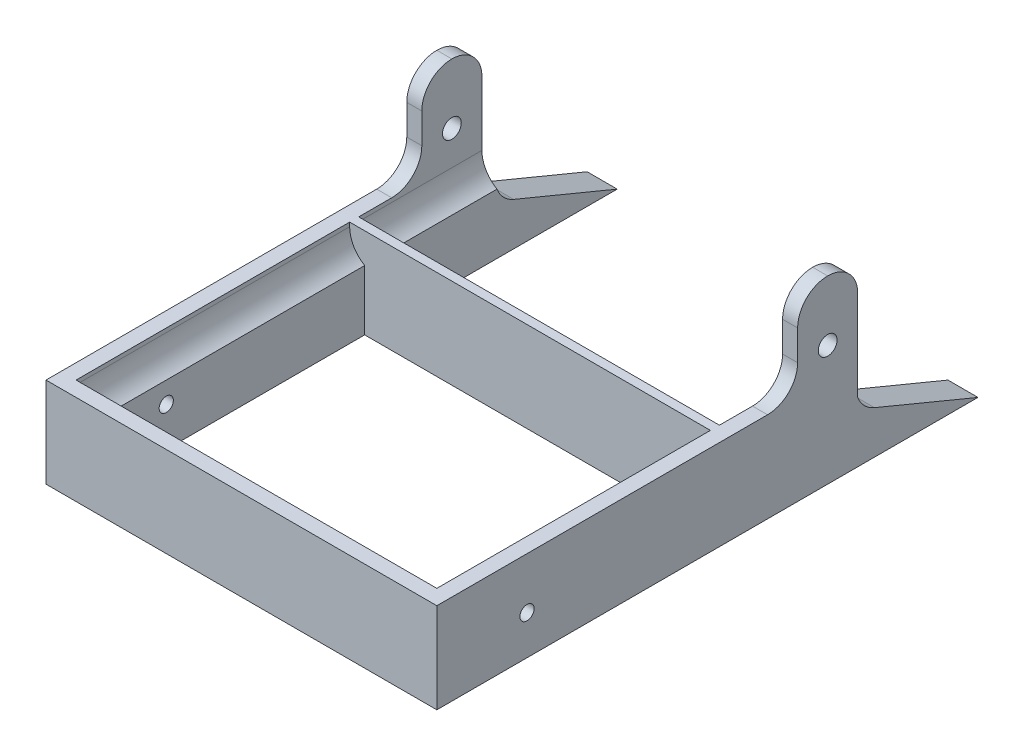
ISO-10303-21;
HEADER;
FILE_DESCRIPTION(('STEP AP214'),'2;1');
FILE_NAME('part.step','',(''),(''),'','','');
FILE_SCHEMA(('AUTOMOTIVE_DESIGN { 1 0 10303 214 1 1 1 1 }'));
ENDSEC;
DATA;
#1=APPLICATION_CONTEXT('core data for automotive mechanical design processes');
#2=APPLICATION_PROTOCOL_DEFINITION('international standard','automotive_design',2000,#1);
#3=PRODUCT_CONTEXT('',#1,'mechanical');
#4=PRODUCT('Part','Part','',(#3));
#5=PRODUCT_RELATED_PRODUCT_CATEGORY('part','',(#4));
#6=PRODUCT_DEFINITION_FORMATION('','',#4);
#7=PRODUCT_DEFINITION_CONTEXT('part definition',#1,'design');
#8=PRODUCT_DEFINITION('design','',#6,#7);
#9=PRODUCT_DEFINITION_SHAPE('','',#8);
#10=(LENGTH_UNIT() NAMED_UNIT(*) SI_UNIT(.MILLI.,.METRE.));
#11=(NAMED_UNIT(*) PLANE_ANGLE_UNIT() SI_UNIT($,.RADIAN.));
#12=(NAMED_UNIT(*) SI_UNIT($,.STERADIAN.) SOLID_ANGLE_UNIT());
#13=UNCERTAINTY_MEASURE_WITH_UNIT(LENGTH_MEASURE(1.E-05),#10,'distance_accuracy_value','');
#14=(GEOMETRIC_REPRESENTATION_CONTEXT(3) GLOBAL_UNCERTAINTY_ASSIGNED_CONTEXT((#13)) GLOBAL_UNIT_ASSIGNED_CONTEXT((#10,
#11,#12)) REPRESENTATION_CONTEXT('',''));
#15=CARTESIAN_POINT('',(0.,0.,0.));
#16=DIRECTION('',(0.,0.,1.));
#17=DIRECTION('',(1.,0.,0.));
#18=AXIS2_PLACEMENT_3D('',#15,#16,#17);
#19=CARTESIAN_POINT('',(0.,0.,0.));
#20=DIRECTION('',(1.,0.,0.));
#21=DIRECTION('',(0.,0.,1.));
#22=AXIS2_PLACEMENT_3D('',#19,#20,#21);
#23=PLANE('',#22);
#24=DIRECTION('',(0.,-1.,0.));
#25=VECTOR('',#24,1.);
#26=CARTESIAN_POINT('',(0.,0.,171.45));
#27=LINE('',#26,#25);
#28=CARTESIAN_POINT('',(0.,19.05,171.45));
#29=VERTEX_POINT('',#28);
#30=CARTESIAN_POINT('',(0.,-6.35,171.45));
#31=VERTEX_POINT('',#30);
#32=EDGE_CURVE('E375',#29,#31,#27,.T.);
#33=ORIENTED_EDGE('',*,*,#32,.T.);
#34=DIRECTION('',(0.,0.,-1.));
#35=VECTOR('',#34,1.);
#36=CARTESIAN_POINT('',(0.,-6.34999999999999,-50.8));
#37=LINE('',#36,#35);
#38=CARTESIAN_POINT('',(0.,-6.35000000000001,55.88));
#39=VERTEX_POINT('',#38);
#40=EDGE_CURVE('E445',#31,#39,#37,.T.);
#41=ORIENTED_EDGE('',*,*,#40,.T.);
#42=DIRECTION('',(0.,1.,0.));
#43=VECTOR('',#42,1.);
#44=CARTESIAN_POINT('',(0.,0.,55.88));
#45=LINE('',#44,#43);
#46=CARTESIAN_POINT('',(0.,19.05,55.88));
#47=VERTEX_POINT('',#46);
#48=EDGE_CURVE('E391',#39,#47,#45,.T.);
#49=ORIENTED_EDGE('',*,*,#48,.T.);
#50=DIRECTION('',(0.,0.,1.));
#51=VECTOR('',#50,1.);
#52=CARTESIAN_POINT('',(0.,19.05,25.4));
#53=LINE('',#52,#51);
#54=EDGE_CURVE('E451',#47,#29,#53,.T.);
#55=ORIENTED_EDGE('',*,*,#54,.T.);
#56=EDGE_LOOP('',(#33,#41,#49,#55));
#57=FACE_BOUND('',#56,.T.);
#58=CARTESIAN_POINT('',(0.,10.16,139.7));
#59=DIRECTION('',(-1.,0.,0.));
#60=DIRECTION('',(0.,0.,1.));
#61=AXIS2_PLACEMENT_3D('',#58,#59,#60);
#62=CIRCLE('',#61,2.99999999999999);
#63=CARTESIAN_POINT('',(0.,10.16,142.7));
#64=VERTEX_POINT('',#63);
#65=EDGE_CURVE('E394',#64,#64,#62,.T.);
#66=ORIENTED_EDGE('',*,*,#65,.T.);
#67=EDGE_LOOP('',(#66));
#68=FACE_BOUND('',#67,.T.);
#69=ADVANCED_FACE('F43',(#57,#68),#23,.T.);
#70=CARTESIAN_POINT('',(-6.35,23.513519620022,-11.8897852210071));
#71=DIRECTION('',(-1.,0.,0.));
#72=DIRECTION('',(0.,0.,-1.));
#73=AXIS2_PLACEMENT_3D('',#70,#71,#72);
#74=PLANE('',#73);
#75=DIRECTION('',(0.,0.,-1.));
#76=VECTOR('',#75,1.);
#77=CARTESIAN_POINT('',(-6.35,30.0485226280624,-11.8897852210071));
#78=LINE('',#77,#76);
#79=CARTESIAN_POINT('',(-6.35,30.0485226280624,55.88));
#80=VERTEX_POINT('',#79);
#81=CARTESIAN_POINT('',(-6.35,30.0485226280624,171.45));
#82=VERTEX_POINT('',#81);
#83=EDGE_CURVE('E462',#80,#82,#78,.F.);
#84=ORIENTED_EDGE('',*,*,#83,.F.);
#85=DIRECTION('',(0.,1.,0.));
#86=VECTOR('',#85,1.);
#87=CARTESIAN_POINT('',(-6.35,31.75,55.88));
#88=LINE('',#87,#86);
#89=CARTESIAN_POINT('',(-6.35,31.75,55.8800000000001));
#90=VERTEX_POINT('',#89);
#91=EDGE_CURVE('E383',#80,#90,#88,.T.);
#92=ORIENTED_EDGE('',*,*,#91,.T.);
#93=DIRECTION('',(0.,0.,-1.));
#94=VECTOR('',#93,1.);
#95=CARTESIAN_POINT('',(-6.35,31.75,177.8));
#96=LINE('',#95,#94);
#97=CARTESIAN_POINT('',(-6.35,31.75,171.45));
#98=VERTEX_POINT('',#97);
#99=EDGE_CURVE('E408',#98,#90,#96,.T.);
#100=ORIENTED_EDGE('',*,*,#99,.F.);
#101=DIRECTION('',(0.,-1.,0.));
#102=VECTOR('',#101,1.);
#103=CARTESIAN_POINT('',(-6.35,31.75,171.45));
#104=LINE('',#103,#102);
#105=EDGE_CURVE('E255',#98,#82,#104,.T.);
#106=ORIENTED_EDGE('',*,*,#105,.T.);
#107=EDGE_LOOP('',(#84,#92,#100,#106));
#108=FACE_BOUND('',#107,.T.);
#109=ADVANCED_FACE('F576',(#108),#74,.F.);
#110=CARTESIAN_POINT('',(6.35,30.0485226280624,25.4));
#111=DIRECTION('',(0.,0.,-1.));
#112=DIRECTION('',(1.,0.,0.));
#113=AXIS2_PLACEMENT_3D('',#110,#111,#112);
#114=CYLINDRICAL_SURFACE('',#113,12.7);
#115=ORIENTED_EDGE('',*,*,#54,.F.);
#116=CARTESIAN_POINT('',(6.35,30.0485226280624,55.88));
#117=DIRECTION('',(0.,0.,-1.));
#118=DIRECTION('',(0.,-1.,0.));
#119=AXIS2_PLACEMENT_3D('',#116,#117,#118);
#120=CIRCLE('',#119,12.7);
#121=EDGE_CURVE('E12',#80,#47,#120,.F.);
#122=ORIENTED_EDGE('',*,*,#121,.F.);
#123=ORIENTED_EDGE('',*,*,#83,.T.);
#124=CARTESIAN_POINT('',(6.35,30.0485226280624,171.45));
#125=DIRECTION('',(0.,0.,1.));
#126=DIRECTION('',(1.,0.,0.));
#127=AXIS2_PLACEMENT_3D('',#124,#125,#126);
#128=CIRCLE('',#127,12.7);
#129=EDGE_CURVE('E260',#29,#82,#128,.F.);
#130=ORIENTED_EDGE('',*,*,#129,.F.);
#131=EDGE_LOOP('',(#115,#122,#123,#130));
#132=FACE_BOUND('',#131,.T.);
#133=ADVANCED_FACE('F583',(#132),#114,.F.);
#134=CARTESIAN_POINT('',(-6.35,-6.35,25.4));
#135=DIRECTION('',(0.,0.,-1.));
#136=DIRECTION('',(0.,1.,0.));
#137=AXIS2_PLACEMENT_3D('',#134,#135,#136);
#138=PLANE('',#137);
#139=DIRECTION('',(0.,-1.,0.));
#140=VECTOR('',#139,1.);
#141=CARTESIAN_POINT('',(-6.35,-6.35,25.4));
#142=LINE('',#141,#140);
#143=CARTESIAN_POINT('',(-6.35,57.15,25.4));
#144=VERTEX_POINT('',#143);
#145=CARTESIAN_POINT('',(-6.35,44.45,25.4));
#146=VERTEX_POINT('',#145);
#147=EDGE_CURVE('E420',#144,#146,#142,.T.);
#148=ORIENTED_EDGE('',*,*,#147,.F.);
#149=DIRECTION('',(1.,0.,0.));
#150=VECTOR('',#149,1.);
#151=CARTESIAN_POINT('',(-6.35,57.15,25.4));
#152=LINE('',#151,#150);
#153=CARTESIAN_POINT('',(-12.7,57.15,25.4));
#154=VERTEX_POINT('',#153);
#155=EDGE_CURVE('E482',#154,#144,#152,.T.);
#156=ORIENTED_EDGE('',*,*,#155,.F.);
#157=DIRECTION('',(0.,-1.,0.));
#158=VECTOR('',#157,1.);
#159=CARTESIAN_POINT('',(-12.7,-6.35,25.4));
#160=LINE('',#159,#158);
#161=CARTESIAN_POINT('',(-12.7,44.45,25.4));
#162=VERTEX_POINT('',#161);
#163=EDGE_CURVE('E421',#154,#162,#160,.T.);
#164=ORIENTED_EDGE('',*,*,#163,.T.);
#165=DIRECTION('',(1.,0.,0.));
#166=VECTOR('',#165,1.);
#167=CARTESIAN_POINT('',(-12.7,44.45,25.4));
#168=LINE('',#167,#166);
#169=EDGE_CURVE('E488',#146,#162,#168,.F.);
#170=ORIENTED_EDGE('',*,*,#169,.F.);
#171=EDGE_LOOP('',(#148,#156,#164,#170));
#172=FACE_BOUND('',#171,.T.);
#173=ADVANCED_FACE('F524',(#172),#138,.F.);
#174=CARTESIAN_POINT('',(-6.35,-6.34999999999999,-50.8));
#175=DIRECTION('',(0.,1.,0.));
#176=DIRECTION('',(0.,0.,1.));
#177=AXIS2_PLACEMENT_3D('',#174,#175,#176);
#178=PLANE('',#177);
#179=DIRECTION('',(-1.,0.,0.));
#180=VECTOR('',#179,1.);
#181=CARTESIAN_POINT('',(0.,-6.35,177.8));
#182=LINE('',#181,#180);
#183=CARTESIAN_POINT('',(152.4,-6.35,177.8));
#184=VERTEX_POINT('',#183);
#185=CARTESIAN_POINT('',(-12.7,-6.35,177.8));
#186=VERTEX_POINT('',#185);
#187=EDGE_CURVE('E405',#184,#186,#182,.T.);
#188=ORIENTED_EDGE('',*,*,#187,.T.);
#189=DIRECTION('',(0.,0.,-1.));
#190=VECTOR('',#189,1.);
#191=CARTESIAN_POINT('',(-12.7,-6.35,25.4));
#192=LINE('',#191,#190);
#193=CARTESIAN_POINT('',(-12.7,-6.34999999999999,-50.8));
#194=VERTEX_POINT('',#193);
#195=EDGE_CURVE('E424',#186,#194,#192,.T.);
#196=ORIENTED_EDGE('',*,*,#195,.T.);
#197=DIRECTION('',(1.,0.,0.));
#198=VECTOR('',#197,1.);
#199=CARTESIAN_POINT('',(-6.35,-6.34999999999999,-50.8));
#200=LINE('',#199,#198);
#201=CARTESIAN_POINT('',(0.,-6.34999999999999,-50.8));
#202=VERTEX_POINT('',#201);
#203=EDGE_CURVE('E454',#194,#202,#200,.T.);
#204=ORIENTED_EDGE('',*,*,#203,.T.);
#205=CARTESIAN_POINT('',(0.,-6.35000000000001,52.07));
#206=VERTEX_POINT('',#205);
#207=EDGE_CURVE('E444',#206,#202,#37,.T.);
#208=ORIENTED_EDGE('',*,*,#207,.F.);
#209=DIRECTION('',(1.,0.,0.));
#210=VECTOR('',#209,1.);
#211=CARTESIAN_POINT('',(-44.9755420673937,-6.35,52.07));
#212=LINE('',#211,#210);
#213=CARTESIAN_POINT('',(139.7,-6.35000000000001,52.07));
#214=VERTEX_POINT('',#213);
#215=EDGE_CURVE('E381',#206,#214,#212,.T.);
#216=ORIENTED_EDGE('',*,*,#215,.T.);
#217=DIRECTION('',(0.,0.,-1.));
#218=VECTOR('',#217,1.);
#219=CARTESIAN_POINT('',(139.7,-6.34999999999999,-50.8));
#220=LINE('',#219,#218);
#221=CARTESIAN_POINT('',(139.7,-6.34999999999999,-50.8));
#222=VERTEX_POINT('',#221);
#223=EDGE_CURVE('E316',#214,#222,#220,.T.);
#224=ORIENTED_EDGE('',*,*,#223,.T.);
#225=DIRECTION('',(-1.,0.,0.));
#226=VECTOR('',#225,1.);
#227=CARTESIAN_POINT('',(146.05,-6.34999999999999,-50.8));
#228=LINE('',#227,#226);
#229=CARTESIAN_POINT('',(152.4,-6.34999999999999,-50.8));
#230=VERTEX_POINT('',#229);
#231=EDGE_CURVE('E325',#230,#222,#228,.T.);
#232=ORIENTED_EDGE('',*,*,#231,.F.);
#233=DIRECTION('',(0.,0.,-1.));
#234=VECTOR('',#233,1.);
#235=CARTESIAN_POINT('',(152.4,-6.35,25.4));
#236=LINE('',#235,#234);
#237=EDGE_CURVE('E296',#184,#230,#236,.T.);
#238=ORIENTED_EDGE('',*,*,#237,.F.);
#239=EDGE_LOOP('',(#188,#196,#204,#208,#216,#224,#232,#238));
#240=FACE_BOUND('',#239,.T.);
#241=ORIENTED_EDGE('',*,*,#40,.F.);
#242=DIRECTION('',(1.,0.,0.));
#243=VECTOR('',#242,1.);
#244=CARTESIAN_POINT('',(-44.9755420673937,-6.35,171.45));
#245=LINE('',#244,#243);
#246=CARTESIAN_POINT('',(139.7,-6.35,171.45));
#247=VERTEX_POINT('',#246);
#248=EDGE_CURVE('E371',#31,#247,#245,.T.);
#249=ORIENTED_EDGE('',*,*,#248,.T.);
#250=CARTESIAN_POINT('',(139.7,-6.35000000000001,55.88));
#251=VERTEX_POINT('',#250);
#252=EDGE_CURVE('E317',#247,#251,#220,.T.);
#253=ORIENTED_EDGE('',*,*,#252,.T.);
#254=DIRECTION('',(1.,0.,0.));
#255=VECTOR('',#254,1.);
#256=CARTESIAN_POINT('',(-44.9755420673937,-6.35,55.88));
#257=LINE('',#256,#255);
#258=EDGE_CURVE('E66',#39,#251,#257,.T.);
#259=ORIENTED_EDGE('',*,*,#258,.F.);
#260=EDGE_LOOP('',(#241,#249,#253,#259));
#261=FACE_BOUND('',#260,.T.);
#262=ADVANCED_FACE('F598',(#240,#261),#178,.F.);
#263=CARTESIAN_POINT('',(-6.35,14.6920489685529,0.));
#264=DIRECTION('',(0.,-0.923879532511289,0.382683432365084));
#265=DIRECTION('',(0.,-0.382683432365084,-0.923879532511289));
#266=AXIS2_PLACEMENT_3D('',#263,#264,#265);
#267=PLANE('',#266);
#268=DIRECTION('',(0.,0.382683432365084,0.923879532511289));
#269=VECTOR('',#268,1.);
#270=CARTESIAN_POINT('',(0.,14.6920489685529,0.));
#271=LINE('',#270,#269);
#272=CARTESIAN_POINT('',(0.,11.7802495571286,-7.02970562997053));
#273=VERTEX_POINT('',#272);
#274=EDGE_CURVE('E448',#202,#273,#271,.T.);
#275=ORIENTED_EDGE('',*,*,#274,.F.);
#276=ORIENTED_EDGE('',*,*,#203,.F.);
#277=DIRECTION('',(0.,0.382683432365084,0.923879532511289));
#278=VECTOR('',#277,1.);
#279=CARTESIAN_POINT('',(-12.7,-6.34999999999999,-50.8));
#280=LINE('',#279,#278);
#281=CARTESIAN_POINT('',(-12.7,11.7802495571286,-7.02970562997053));
#282=VERTEX_POINT('',#281);
#283=EDGE_CURVE('E428',#194,#282,#280,.T.);
#284=ORIENTED_EDGE('',*,*,#283,.T.);
#285=DIRECTION('',(-1.,0.,0.));
#286=VECTOR('',#285,1.);
#287=CARTESIAN_POINT('',(-6.35,11.7802495571286,-7.02970562997053));
#288=LINE('',#287,#286);
#289=EDGE_CURVE('E457',#273,#282,#288,.T.);
#290=ORIENTED_EDGE('',*,*,#289,.F.);
#291=EDGE_LOOP('',(#275,#276,#284,#290));
#292=FACE_BOUND('',#291,.T.);
#293=ADVANCED_FACE('F591',(#292),#267,.F.);
#294=DIRECTION('',(0.,-1.,0.));
#295=VECTOR('',#294,1.);
#296=CARTESIAN_POINT('',(0.,0.,52.07));
#297=LINE('',#296,#295);
#298=CARTESIAN_POINT('',(0.,19.05,52.07));
#299=VERTEX_POINT('',#298);
#300=EDGE_CURVE('E58',#299,#206,#297,.T.);
#301=ORIENTED_EDGE('',*,*,#300,.T.);
#302=ORIENTED_EDGE('',*,*,#207,.T.);
#303=ORIENTED_EDGE('',*,*,#274,.T.);
#304=CARTESIAN_POINT('',(0.,23.513519620022,-11.8897852210071));
#305=DIRECTION('',(-1.,0.,0.));
#306=DIRECTION('',(0.,0.,1.));
#307=AXIS2_PLACEMENT_3D('',#304,#305,#306);
#308=CIRCLE('',#307,12.7);
#309=CARTESIAN_POINT('',(0.,19.05,0.));
#310=VERTEX_POINT('',#309);
#311=EDGE_CURVE('E460',#310,#273,#308,.F.);
#312=ORIENTED_EDGE('',*,*,#311,.F.);
#313=EDGE_CURVE('E452',#310,#299,#53,.T.);
#314=ORIENTED_EDGE('',*,*,#313,.T.);
#315=EDGE_LOOP('',(#301,#302,#303,#312,#314));
#316=FACE_BOUND('',#315,.T.);
#317=ADVANCED_FACE('F579',(#316),#23,.T.);
#318=CARTESIAN_POINT('',(-6.35,23.513519620022,-11.8897852210071));
#319=DIRECTION('',(-1.,0.,0.));
#320=DIRECTION('',(0.,0.,-1.));
#321=AXIS2_PLACEMENT_3D('',#318,#319,#320);
#322=CYLINDRICAL_SURFACE('',#321,12.7);
#323=ORIENTED_EDGE('',*,*,#311,.T.);
#324=ORIENTED_EDGE('',*,*,#289,.T.);
#325=CARTESIAN_POINT('',(-12.7,23.513519620022,-11.8897852210071));
#326=DIRECTION('',(-1.,0.,0.));
#327=DIRECTION('',(0.,0.,-1.));
#328=AXIS2_PLACEMENT_3D('',#325,#326,#327);
#329=CIRCLE('',#328,12.7);
#330=CARTESIAN_POINT('',(-12.7,19.05,0.));
#331=VERTEX_POINT('',#330);
#332=EDGE_CURVE('E431',#282,#331,#329,.T.);
#333=ORIENTED_EDGE('',*,*,#332,.T.);
#334=DIRECTION('',(1.,0.,0.));
#335=VECTOR('',#334,1.);
#336=CARTESIAN_POINT('',(-12.7,19.05,0.));
#337=LINE('',#336,#335);
#338=EDGE_CURVE('E437',#331,#310,#337,.T.);
#339=ORIENTED_EDGE('',*,*,#338,.T.);
#340=EDGE_LOOP('',(#323,#324,#333,#339));
#341=FACE_BOUND('',#340,.T.);
#342=ADVANCED_FACE('F590',(#341),#322,.F.);
#343=CARTESIAN_POINT('',(-6.35,44.45,12.7));
#344=DIRECTION('',(1.,0.,0.));
#345=DIRECTION('',(0.,0.,-1.));
#346=AXIS2_PLACEMENT_3D('',#343,#344,#345);
#347=CIRCLE('',#346,3.96875);
#348=CARTESIAN_POINT('',(-6.35,44.45,8.73124999999999));
#349=VERTEX_POINT('',#348);
#350=EDGE_CURVE('E417',#349,#349,#347,.T.);
#351=ORIENTED_EDGE('',*,*,#350,.F.);
#352=EDGE_LOOP('',(#351));
#353=FACE_BOUND('',#352,.T.);
#354=CARTESIAN_POINT('',(-6.35,30.0485226280624,0.));
#355=VERTEX_POINT('',#354);
#356=CARTESIAN_POINT('',(-6.35,30.0485226280624,52.07));
#357=VERTEX_POINT('',#356);
#358=EDGE_CURVE('E463',#355,#357,#78,.F.);
#359=ORIENTED_EDGE('',*,*,#358,.F.);
#360=DIRECTION('',(0.,1.,0.));
#361=VECTOR('',#360,1.);
#362=CARTESIAN_POINT('',(-6.35,19.05,0.));
#363=LINE('',#362,#361);
#364=CARTESIAN_POINT('',(-6.35,57.15,0.));
#365=VERTEX_POINT('',#364);
#366=EDGE_CURVE('E425',#355,#365,#363,.T.);
#367=ORIENTED_EDGE('',*,*,#366,.T.);
#368=CARTESIAN_POINT('',(-6.35,57.15,12.7));
#369=DIRECTION('',(1.,0.,0.));
#370=DIRECTION('',(0.,0.,-1.));
#371=AXIS2_PLACEMENT_3D('',#368,#369,#370);
#372=CIRCLE('',#371,12.7);
#373=CARTESIAN_POINT('',(-6.35,69.85,12.7));
#374=VERTEX_POINT('',#373);
#375=EDGE_CURVE('E471',#374,#365,#372,.F.);
#376=ORIENTED_EDGE('',*,*,#375,.F.);
#377=CARTESIAN_POINT('',(-6.35,57.15,12.7));
#378=DIRECTION('',(1.,0.,0.));
#379=DIRECTION('',(0.,0.,-1.));
#380=AXIS2_PLACEMENT_3D('',#377,#378,#379);
#381=CIRCLE('',#380,12.7);
#382=EDGE_CURVE('E468',#144,#374,#381,.F.);
#383=ORIENTED_EDGE('',*,*,#382,.F.);
#384=ORIENTED_EDGE('',*,*,#147,.T.);
#385=CARTESIAN_POINT('',(-6.35,44.45,38.1));
#386=DIRECTION('',(1.,0.,0.));
#387=DIRECTION('',(0.,0.,-1.));
#388=AXIS2_PLACEMENT_3D('',#385,#386,#387);
#389=CIRCLE('',#388,12.7);
#390=CARTESIAN_POINT('',(-6.35,31.75,38.1000000000001));
#391=VERTEX_POINT('',#390);
#392=EDGE_CURVE('E491',#391,#146,#389,.T.);
#393=ORIENTED_EDGE('',*,*,#392,.F.);
#394=CARTESIAN_POINT('',(-6.35,31.75,52.07));
#395=VERTEX_POINT('',#394);
#396=EDGE_CURVE('E407',#395,#391,#96,.T.);
#397=ORIENTED_EDGE('',*,*,#396,.F.);
#398=DIRECTION('',(0.,-1.,0.));
#399=VECTOR('',#398,1.);
#400=CARTESIAN_POINT('',(-6.35,31.75,52.07));
#401=LINE('',#400,#399);
#402=EDGE_CURVE('E378',#395,#357,#401,.T.);
#403=ORIENTED_EDGE('',*,*,#402,.T.);
#404=EDGE_LOOP('',(#359,#367,#376,#383,#384,#393,#397,#403));
#405=FACE_BOUND('',#404,.T.);
#406=ADVANCED_FACE('F504',(#353,#405),#74,.F.);
#407=CARTESIAN_POINT('',(-12.7,19.05,0.));
#408=DIRECTION('',(0.,0.,1.));
#409=DIRECTION('',(0.,-1.,0.));
#410=AXIS2_PLACEMENT_3D('',#407,#408,#409);
#411=PLANE('',#410);
#412=ORIENTED_EDGE('',*,*,#366,.F.);
#413=CARTESIAN_POINT('',(6.35,30.0485226280624,0.));
#414=DIRECTION('',(0.,0.,-1.));
#415=DIRECTION('',(0.,-1.,0.));
#416=AXIS2_PLACEMENT_3D('',#413,#414,#415);
#417=CIRCLE('',#416,12.7);
#418=EDGE_CURVE('E466',#310,#355,#417,.T.);
#419=ORIENTED_EDGE('',*,*,#418,.F.);
#420=ORIENTED_EDGE('',*,*,#338,.F.);
#421=DIRECTION('',(0.,1.,0.));
#422=VECTOR('',#421,1.);
#423=CARTESIAN_POINT('',(-12.7,19.05,0.));
#424=LINE('',#423,#422);
#425=CARTESIAN_POINT('',(-12.7,57.15,0.));
#426=VERTEX_POINT('',#425);
#427=EDGE_CURVE('E434',#331,#426,#424,.T.);
#428=ORIENTED_EDGE('',*,*,#427,.T.);
#429=DIRECTION('',(1.,0.,0.));
#430=VECTOR('',#429,1.);
#431=CARTESIAN_POINT('',(-12.7,57.15,0.));
#432=LINE('',#431,#430);
#433=EDGE_CURVE('E474',#365,#426,#432,.F.);
#434=ORIENTED_EDGE('',*,*,#433,.F.);
#435=EDGE_LOOP('',(#412,#419,#420,#428,#434));
#436=FACE_BOUND('',#435,.T.);
#437=ADVANCED_FACE('F512',(#436),#411,.F.);
#438=CARTESIAN_POINT('',(-12.7,23.513519620022,-11.8897852210071));
#439=DIRECTION('',(-1.,0.,0.));
#440=DIRECTION('',(0.,0.,-1.));
#441=AXIS2_PLACEMENT_3D('',#438,#439,#440);
#442=PLANE('',#441);
#443=CARTESIAN_POINT('',(-12.7,10.16,139.7));
#444=DIRECTION('',(-1.,0.,0.));
#445=DIRECTION('',(0.,0.,1.));
#446=AXIS2_PLACEMENT_3D('',#443,#444,#445);
#447=CIRCLE('',#446,2.99999999999999);
#448=CARTESIAN_POINT('',(-12.7,10.16,142.7));
#449=VERTEX_POINT('',#448);
#450=EDGE_CURVE('E395',#449,#449,#447,.T.);
#451=ORIENTED_EDGE('',*,*,#450,.F.);
#452=EDGE_LOOP('',(#451));
#453=FACE_BOUND('',#452,.T.);
#454=CARTESIAN_POINT('',(-12.7,44.45,12.7));
#455=DIRECTION('',(1.,0.,0.));
#456=DIRECTION('',(0.,0.,-1.));
#457=AXIS2_PLACEMENT_3D('',#454,#455,#456);
#458=CIRCLE('',#457,3.96875);
#459=CARTESIAN_POINT('',(-12.7,44.45,8.73124999999999));
#460=VERTEX_POINT('',#459);
#461=EDGE_CURVE('E414',#460,#460,#458,.T.);
#462=ORIENTED_EDGE('',*,*,#461,.T.);
#463=EDGE_LOOP('',(#462));
#464=FACE_BOUND('',#463,.T.);
#465=ORIENTED_EDGE('',*,*,#427,.F.);
#466=ORIENTED_EDGE('',*,*,#332,.F.);
#467=ORIENTED_EDGE('',*,*,#283,.F.);
#468=ORIENTED_EDGE('',*,*,#195,.F.);
#469=DIRECTION('',(0.,1.,0.));
#470=VECTOR('',#469,1.);
#471=CARTESIAN_POINT('',(-12.7,31.75,177.8));
#472=LINE('',#471,#470);
#473=CARTESIAN_POINT('',(-12.7,31.75,177.8));
#474=VERTEX_POINT('',#473);
#475=EDGE_CURVE('E398',#186,#474,#472,.T.);
#476=ORIENTED_EDGE('',*,*,#475,.T.);
#477=DIRECTION('',(0.,0.,-1.));
#478=VECTOR('',#477,1.);
#479=CARTESIAN_POINT('',(-12.7,31.75,177.8));
#480=LINE('',#479,#478);
#481=CARTESIAN_POINT('',(-12.7,31.75,38.1000000000001));
#482=VERTEX_POINT('',#481);
#483=EDGE_CURVE('E410',#474,#482,#480,.T.);
#484=ORIENTED_EDGE('',*,*,#483,.T.);
#485=CARTESIAN_POINT('',(-12.7,44.45,38.1));
#486=DIRECTION('',(1.,0.,0.));
#487=DIRECTION('',(0.,0.,-1.));
#488=AXIS2_PLACEMENT_3D('',#485,#486,#487);
#489=CIRCLE('',#488,12.7);
#490=EDGE_CURVE('E493',#162,#482,#489,.F.);
#491=ORIENTED_EDGE('',*,*,#490,.F.);
#492=ORIENTED_EDGE('',*,*,#163,.F.);
#493=CARTESIAN_POINT('',(-12.7,57.15,12.7));
#494=DIRECTION('',(1.,0.,0.));
#495=DIRECTION('',(0.,0.,-1.));
#496=AXIS2_PLACEMENT_3D('',#493,#494,#495);
#497=CIRCLE('',#496,12.7);
#498=CARTESIAN_POINT('',(-12.7,69.85,12.7));
#499=VERTEX_POINT('',#498);
#500=EDGE_CURVE('E477',#499,#154,#497,.T.);
#501=ORIENTED_EDGE('',*,*,#500,.F.);
#502=CARTESIAN_POINT('',(-12.7,57.15,12.7));
#503=DIRECTION('',(1.,0.,0.));
#504=DIRECTION('',(0.,0.,-1.));
#505=AXIS2_PLACEMENT_3D('',#502,#503,#504);
#506=CIRCLE('',#505,12.7);
#507=EDGE_CURVE('E479',#426,#499,#506,.T.);
#508=ORIENTED_EDGE('',*,*,#507,.F.);
#509=EDGE_LOOP('',(#465,#466,#467,#468,#476,#484,#491,#492,#501,#508));
#510=FACE_BOUND('',#509,.T.);
#511=ADVANCED_FACE('F611',(#453,#464,#510),#442,.T.);
#512=ORIENTED_EDGE('',*,*,#313,.F.);
#513=ORIENTED_EDGE('',*,*,#418,.T.);
#514=ORIENTED_EDGE('',*,*,#358,.T.);
#515=CARTESIAN_POINT('',(6.35,30.0485226280624,52.07));
#516=DIRECTION('',(0.,0.,1.));
#517=DIRECTION('',(0.,1.,0.));
#518=AXIS2_PLACEMENT_3D('',#515,#516,#517);
#519=CIRCLE('',#518,12.7);
#520=EDGE_CURVE('E51',#299,#357,#519,.F.);
#521=ORIENTED_EDGE('',*,*,#520,.F.);
#522=EDGE_LOOP('',(#512,#513,#514,#521));
#523=FACE_BOUND('',#522,.T.);
#524=ADVANCED_FACE('F507',(#523),#114,.F.);
#525=CARTESIAN_POINT('',(0.,44.45,12.7));
#526=DIRECTION('',(-1.,0.,0.));
#527=DIRECTION('',(0.,0.,-1.));
#528=AXIS2_PLACEMENT_3D('',#525,#526,#527);
#529=CYLINDRICAL_SURFACE('',#528,3.96875);
#530=ORIENTED_EDGE('',*,*,#461,.F.);
#531=EDGE_LOOP('',(#530));
#532=FACE_BOUND('',#531,.T.);
#533=ORIENTED_EDGE('',*,*,#350,.T.);
#534=EDGE_LOOP('',(#533));
#535=FACE_BOUND('',#534,.T.);
#536=ADVANCED_FACE('F610',(#532,#535),#529,.F.);
#537=CARTESIAN_POINT('',(-6.35,57.15,12.7));
#538=DIRECTION('',(1.,0.,0.));
#539=DIRECTION('',(0.,0.,1.));
#540=AXIS2_PLACEMENT_3D('',#537,#538,#539);
#541=CYLINDRICAL_SURFACE('',#540,12.7);
#542=ORIENTED_EDGE('',*,*,#155,.T.);
#543=ORIENTED_EDGE('',*,*,#382,.T.);
#544=DIRECTION('',(1.,0.,0.));
#545=VECTOR('',#544,1.);
#546=CARTESIAN_POINT('',(-12.7,69.85,12.7));
#547=LINE('',#546,#545);
#548=EDGE_CURVE('E413',#374,#499,#547,.F.);
#549=ORIENTED_EDGE('',*,*,#548,.T.);
#550=ORIENTED_EDGE('',*,*,#500,.T.);
#551=EDGE_LOOP('',(#542,#543,#549,#550));
#552=FACE_BOUND('',#551,.T.);
#553=ADVANCED_FACE('F518',(#552),#541,.T.);
#554=CARTESIAN_POINT('',(-12.7,57.15,12.7));
#555=DIRECTION('',(1.,0.,0.));
#556=DIRECTION('',(0.,0.,1.));
#557=AXIS2_PLACEMENT_3D('',#554,#555,#556);
#558=CYLINDRICAL_SURFACE('',#557,12.7);
#559=ORIENTED_EDGE('',*,*,#507,.T.);
#560=ORIENTED_EDGE('',*,*,#548,.F.);
#561=ORIENTED_EDGE('',*,*,#375,.T.);
#562=ORIENTED_EDGE('',*,*,#433,.T.);
#563=EDGE_LOOP('',(#559,#560,#561,#562));
#564=FACE_BOUND('',#563,.T.);
#565=ADVANCED_FACE('F515',(#564),#558,.T.);
#566=CARTESIAN_POINT('',(-6.35,31.75,177.8));
#567=DIRECTION('',(0.,-1.,0.));
#568=DIRECTION('',(0.,0.,-1.));
#569=AXIS2_PLACEMENT_3D('',#566,#567,#568);
#570=PLANE('',#569);
#571=DIRECTION('',(1.,0.,0.));
#572=VECTOR('',#571,1.);
#573=CARTESIAN_POINT('',(-44.9755420673937,31.75,171.45));
#574=LINE('',#573,#572);
#575=CARTESIAN_POINT('',(146.05,31.75,171.45));
#576=VERTEX_POINT('',#575);
#577=EDGE_CURVE('E248',#98,#576,#574,.T.);
#578=ORIENTED_EDGE('',*,*,#577,.F.);
#579=ORIENTED_EDGE('',*,*,#99,.T.);
#580=DIRECTION('',(1.,0.,0.));
#581=VECTOR('',#580,1.);
#582=CARTESIAN_POINT('',(-44.9755420673937,31.75,55.88));
#583=LINE('',#582,#581);
#584=CARTESIAN_POINT('',(146.05,31.75,55.8800000000001));
#585=VERTEX_POINT('',#584);
#586=EDGE_CURVE('E273',#90,#585,#583,.T.);
#587=ORIENTED_EDGE('',*,*,#586,.T.);
#588=DIRECTION('',(0.,0.,-1.));
#589=VECTOR('',#588,1.);
#590=CARTESIAN_POINT('',(146.05,31.75,177.8));
#591=LINE('',#590,#589);
#592=EDGE_CURVE('E266',#576,#585,#591,.T.);
#593=ORIENTED_EDGE('',*,*,#592,.F.);
#594=EDGE_LOOP('',(#578,#579,#587,#593));
#595=FACE_BOUND('',#594,.T.);
#596=DIRECTION('',(1.,0.,0.));
#597=VECTOR('',#596,1.);
#598=CARTESIAN_POINT('',(-6.35,31.75,177.8));
#599=LINE('',#598,#597);
#600=CARTESIAN_POINT('',(152.4,31.75,177.8));
#601=VERTEX_POINT('',#600);
#602=EDGE_CURVE('E403',#474,#601,#599,.T.);
#603=ORIENTED_EDGE('',*,*,#602,.T.);
#604=DIRECTION('',(0.,0.,-1.));
#605=VECTOR('',#604,1.);
#606=CARTESIAN_POINT('',(152.4,31.75,177.8));
#607=LINE('',#606,#605);
#608=CARTESIAN_POINT('',(152.4,31.75,38.1000000000001));
#609=VERTEX_POINT('',#608);
#610=EDGE_CURVE('E275',#601,#609,#607,.T.);
#611=ORIENTED_EDGE('',*,*,#610,.T.);
#612=DIRECTION('',(-1.,0.,0.));
#613=VECTOR('',#612,1.);
#614=CARTESIAN_POINT('',(146.05,31.75,38.1));
#615=LINE('',#614,#613);
#616=CARTESIAN_POINT('',(146.05,31.75,38.1000000000001));
#617=VERTEX_POINT('',#616);
#618=EDGE_CURVE('E354',#609,#617,#615,.T.);
#619=ORIENTED_EDGE('',*,*,#618,.T.);
#620=CARTESIAN_POINT('',(146.05,31.75,52.07));
#621=VERTEX_POINT('',#620);
#622=EDGE_CURVE('E276',#621,#617,#591,.T.);
#623=ORIENTED_EDGE('',*,*,#622,.F.);
#624=DIRECTION('',(1.,0.,0.));
#625=VECTOR('',#624,1.);
#626=CARTESIAN_POINT('',(-44.9755420673937,31.75,52.07));
#627=LINE('',#626,#625);
#628=EDGE_CURVE('E382',#395,#621,#627,.T.);
#629=ORIENTED_EDGE('',*,*,#628,.F.);
#630=ORIENTED_EDGE('',*,*,#396,.T.);
#631=DIRECTION('',(1.,0.,0.));
#632=VECTOR('',#631,1.);
#633=CARTESIAN_POINT('',(-6.35,31.75,38.1));
#634=LINE('',#633,#632);
#635=EDGE_CURVE('E485',#482,#391,#634,.T.);
#636=ORIENTED_EDGE('',*,*,#635,.F.);
#637=ORIENTED_EDGE('',*,*,#483,.F.);
#638=EDGE_LOOP('',(#603,#611,#619,#623,#629,#630,#636,#637));
#639=FACE_BOUND('',#638,.T.);
#640=ADVANCED_FACE('F271',(#595,#639),#570,.F.);
#641=CARTESIAN_POINT('',(6.35,30.0485226280624,177.8));
#642=DIRECTION('',(0.,0.,1.));
#643=DIRECTION('',(-1.,0.,0.));
#644=AXIS2_PLACEMENT_3D('',#641,#642,#643);
#645=PLANE('',#644);
#646=DIRECTION('',(0.,1.,0.));
#647=VECTOR('',#646,1.);
#648=CARTESIAN_POINT('',(152.4,31.75,177.8));
#649=LINE('',#648,#647);
#650=EDGE_CURVE('E282',#184,#601,#649,.T.);
#651=ORIENTED_EDGE('',*,*,#650,.T.);
#652=ORIENTED_EDGE('',*,*,#602,.F.);
#653=ORIENTED_EDGE('',*,*,#475,.F.);
#654=ORIENTED_EDGE('',*,*,#187,.F.);
#655=EDGE_LOOP('',(#651,#652,#653,#654));
#656=FACE_BOUND('',#655,.T.);
#657=ADVANCED_FACE('F673',(#656),#645,.T.);
#658=CARTESIAN_POINT('',(-6.35,44.45,38.1));
#659=DIRECTION('',(-1.,0.,0.));
#660=DIRECTION('',(0.,0.,-1.));
#661=AXIS2_PLACEMENT_3D('',#658,#659,#660);
#662=CYLINDRICAL_SURFACE('',#661,12.7);
#663=ORIENTED_EDGE('',*,*,#490,.T.);
#664=ORIENTED_EDGE('',*,*,#635,.T.);
#665=ORIENTED_EDGE('',*,*,#392,.T.);
#666=ORIENTED_EDGE('',*,*,#169,.T.);
#667=EDGE_LOOP('',(#663,#664,#665,#666));
#668=FACE_BOUND('',#667,.T.);
#669=ADVANCED_FACE('F45',(#668),#662,.F.);
#670=CARTESIAN_POINT('',(-12.7,10.16,139.7));
#671=DIRECTION('',(1.,0.,0.));
#672=DIRECTION('',(0.,0.,1.));
#673=AXIS2_PLACEMENT_3D('',#670,#671,#672);
#674=CYLINDRICAL_SURFACE('',#673,2.99999999999999);
#675=ORIENTED_EDGE('',*,*,#450,.T.);
#676=EDGE_LOOP('',(#675));
#677=FACE_BOUND('',#676,.T.);
#678=ORIENTED_EDGE('',*,*,#65,.F.);
#679=EDGE_LOOP('',(#678));
#680=FACE_BOUND('',#679,.T.);
#681=ADVANCED_FACE('F672',(#677,#680),#674,.F.);
#682=CARTESIAN_POINT('',(-44.9755420673937,31.75,55.88));
#683=DIRECTION('',(0.,0.,1.));
#684=DIRECTION('',(0.,-1.,0.));
#685=AXIS2_PLACEMENT_3D('',#682,#683,#684);
#686=PLANE('',#685);
#687=DIRECTION('',(0.,1.,0.));
#688=VECTOR('',#687,1.);
#689=CARTESIAN_POINT('',(146.05,31.75,55.88));
#690=LINE('',#689,#688);
#691=CARTESIAN_POINT('',(146.05,30.0485226280624,55.88));
#692=VERTEX_POINT('',#691);
#693=EDGE_CURVE('E537',#692,#585,#690,.T.);
#694=ORIENTED_EDGE('',*,*,#693,.T.);
#695=ORIENTED_EDGE('',*,*,#586,.F.);
#696=ORIENTED_EDGE('',*,*,#91,.F.);
#697=ORIENTED_EDGE('',*,*,#121,.T.);
#698=ORIENTED_EDGE('',*,*,#48,.F.);
#699=ORIENTED_EDGE('',*,*,#258,.T.);
#700=DIRECTION('',(0.,1.,0.));
#701=VECTOR('',#700,1.);
#702=CARTESIAN_POINT('',(139.7,0.,55.88));
#703=LINE('',#702,#701);
#704=CARTESIAN_POINT('',(139.7,19.05,55.88));
#705=VERTEX_POINT('',#704);
#706=EDGE_CURVE('E539',#251,#705,#703,.T.);
#707=ORIENTED_EDGE('',*,*,#706,.T.);
#708=CARTESIAN_POINT('',(133.35,30.0485226280624,55.88));
#709=DIRECTION('',(0.,0.,1.));
#710=DIRECTION('',(0.,-1.,0.));
#711=AXIS2_PLACEMENT_3D('',#708,#709,#710);
#712=CIRCLE('',#711,12.7);
#713=EDGE_CURVE('E368',#692,#705,#712,.F.);
#714=ORIENTED_EDGE('',*,*,#713,.F.);
#715=EDGE_LOOP('',(#694,#695,#696,#697,#698,#699,#707,#714));
#716=FACE_BOUND('',#715,.T.);
#717=ADVANCED_FACE('F683',(#716),#686,.T.);
#718=CARTESIAN_POINT('',(-44.9755420673937,31.75,52.07));
#719=DIRECTION('',(0.,0.,-1.));
#720=DIRECTION('',(0.,1.,0.));
#721=AXIS2_PLACEMENT_3D('',#718,#719,#720);
#722=PLANE('',#721);
#723=DIRECTION('',(0.,-1.,0.));
#724=VECTOR('',#723,1.);
#725=CARTESIAN_POINT('',(139.7,0.,52.07));
#726=LINE('',#725,#724);
#727=CARTESIAN_POINT('',(139.7,19.05,52.07));
#728=VERTEX_POINT('',#727);
#729=EDGE_CURVE('E536',#728,#214,#726,.T.);
#730=ORIENTED_EDGE('',*,*,#729,.T.);
#731=ORIENTED_EDGE('',*,*,#215,.F.);
#732=ORIENTED_EDGE('',*,*,#300,.F.);
#733=ORIENTED_EDGE('',*,*,#520,.T.);
#734=ORIENTED_EDGE('',*,*,#402,.F.);
#735=ORIENTED_EDGE('',*,*,#628,.T.);
#736=DIRECTION('',(0.,-1.,0.));
#737=VECTOR('',#736,1.);
#738=CARTESIAN_POINT('',(146.05,31.75,52.07));
#739=LINE('',#738,#737);
#740=CARTESIAN_POINT('',(146.05,30.0485226280624,52.07));
#741=VERTEX_POINT('',#740);
#742=EDGE_CURVE('E531',#621,#741,#739,.T.);
#743=ORIENTED_EDGE('',*,*,#742,.T.);
#744=CARTESIAN_POINT('',(133.35,30.0485226280624,52.07));
#745=DIRECTION('',(0.,0.,-1.));
#746=DIRECTION('',(0.,1.,0.));
#747=AXIS2_PLACEMENT_3D('',#744,#745,#746);
#748=CIRCLE('',#747,12.7);
#749=EDGE_CURVE('E365',#728,#741,#748,.F.);
#750=ORIENTED_EDGE('',*,*,#749,.F.);
#751=EDGE_LOOP('',(#730,#731,#732,#733,#734,#735,#743,#750));
#752=FACE_BOUND('',#751,.T.);
#753=ADVANCED_FACE('F498',(#752),#722,.T.);
#754=CARTESIAN_POINT('',(-44.9755420673937,31.75,171.45));
#755=DIRECTION('',(0.,0.,-1.));
#756=DIRECTION('',(1.,0.,0.));
#757=AXIS2_PLACEMENT_3D('',#754,#755,#756);
#758=PLANE('',#757);
#759=DIRECTION('',(0.,-1.,0.));
#760=VECTOR('',#759,1.);
#761=CARTESIAN_POINT('',(139.7,0.,171.45));
#762=LINE('',#761,#760);
#763=CARTESIAN_POINT('',(139.7,19.05,171.45));
#764=VERTEX_POINT('',#763);
#765=EDGE_CURVE('E541',#764,#247,#762,.T.);
#766=ORIENTED_EDGE('',*,*,#765,.T.);
#767=ORIENTED_EDGE('',*,*,#248,.F.);
#768=ORIENTED_EDGE('',*,*,#32,.F.);
#769=ORIENTED_EDGE('',*,*,#129,.T.);
#770=ORIENTED_EDGE('',*,*,#105,.F.);
#771=ORIENTED_EDGE('',*,*,#577,.T.);
#772=DIRECTION('',(0.,-1.,0.));
#773=VECTOR('',#772,1.);
#774=CARTESIAN_POINT('',(146.05,31.75,171.45));
#775=LINE('',#774,#773);
#776=CARTESIAN_POINT('',(146.05,30.0485226280624,171.45));
#777=VERTEX_POINT('',#776);
#778=EDGE_CURVE('E253',#576,#777,#775,.T.);
#779=ORIENTED_EDGE('',*,*,#778,.T.);
#780=CARTESIAN_POINT('',(133.35,30.0485226280624,171.45));
#781=DIRECTION('',(0.,0.,-1.));
#782=DIRECTION('',(-1.,0.,0.));
#783=AXIS2_PLACEMENT_3D('',#780,#781,#782);
#784=CIRCLE('',#783,12.7);
#785=EDGE_CURVE('E269',#764,#777,#784,.F.);
#786=ORIENTED_EDGE('',*,*,#785,.F.);
#787=EDGE_LOOP('',(#766,#767,#768,#769,#770,#771,#779,#786));
#788=FACE_BOUND('',#787,.T.);
#789=ADVANCED_FACE('F251',(#788),#758,.T.);
#790=CARTESIAN_POINT('',(139.7,0.,0.));
#791=DIRECTION('',(-1.,0.,0.));
#792=DIRECTION('',(0.,0.,1.));
#793=AXIS2_PLACEMENT_3D('',#790,#791,#792);
#794=PLANE('',#793);
#795=ORIENTED_EDGE('',*,*,#765,.F.);
#796=DIRECTION('',(0.,0.,1.));
#797=VECTOR('',#796,1.);
#798=CARTESIAN_POINT('',(139.7,19.05,25.4));
#799=LINE('',#798,#797);
#800=EDGE_CURVE('E322',#705,#764,#799,.T.);
#801=ORIENTED_EDGE('',*,*,#800,.F.);
#802=ORIENTED_EDGE('',*,*,#706,.F.);
#803=ORIENTED_EDGE('',*,*,#252,.F.);
#804=EDGE_LOOP('',(#795,#801,#802,#803));
#805=FACE_BOUND('',#804,.T.);
#806=CARTESIAN_POINT('',(139.7,10.16,139.7));
#807=DIRECTION('',(-1.,0.,0.));
#808=DIRECTION('',(0.,0.,1.));
#809=AXIS2_PLACEMENT_3D('',#806,#807,#808);
#810=CIRCLE('',#809,2.99999999999999);
#811=CARTESIAN_POINT('',(139.7,10.16,142.7));
#812=VERTEX_POINT('',#811);
#813=EDGE_CURVE('E548',#812,#812,#810,.T.);
#814=ORIENTED_EDGE('',*,*,#813,.F.);
#815=EDGE_LOOP('',(#814));
#816=FACE_BOUND('',#815,.T.);
#817=ADVANCED_FACE('F556',(#805,#816),#794,.T.);
#818=CARTESIAN_POINT('',(146.05,23.513519620022,-11.8897852210071));
#819=DIRECTION('',(1.,0.,0.));
#820=DIRECTION('',(0.,0.,-1.));
#821=AXIS2_PLACEMENT_3D('',#818,#819,#820);
#822=PLANE('',#821);
#823=DIRECTION('',(0.,0.,-1.));
#824=VECTOR('',#823,1.);
#825=CARTESIAN_POINT('',(146.05,30.0485226280624,-11.8897852210071));
#826=LINE('',#825,#824);
#827=EDGE_CURVE('E267',#692,#777,#826,.F.);
#828=ORIENTED_EDGE('',*,*,#827,.T.);
#829=ORIENTED_EDGE('',*,*,#778,.F.);
#830=ORIENTED_EDGE('',*,*,#592,.T.);
#831=ORIENTED_EDGE('',*,*,#693,.F.);
#832=EDGE_LOOP('',(#828,#829,#830,#831));
#833=FACE_BOUND('',#832,.T.);
#834=ADVANCED_FACE('F264',(#833),#822,.F.);
#835=CARTESIAN_POINT('',(133.35,30.0485226280624,25.4));
#836=DIRECTION('',(0.,0.,-1.));
#837=DIRECTION('',(-1.,0.,0.));
#838=AXIS2_PLACEMENT_3D('',#835,#836,#837);
#839=CYLINDRICAL_SURFACE('',#838,12.7);
#840=ORIENTED_EDGE('',*,*,#800,.T.);
#841=ORIENTED_EDGE('',*,*,#785,.T.);
#842=ORIENTED_EDGE('',*,*,#827,.F.);
#843=ORIENTED_EDGE('',*,*,#713,.T.);
#844=EDGE_LOOP('',(#840,#841,#842,#843));
#845=FACE_BOUND('',#844,.T.);
#846=ADVANCED_FACE('F565',(#845),#839,.F.);
#847=CARTESIAN_POINT('',(146.05,-6.35,25.4));
#848=DIRECTION('',(0.,0.,-1.));
#849=DIRECTION('',(0.,1.,0.));
#850=AXIS2_PLACEMENT_3D('',#847,#848,#849);
#851=PLANE('',#850);
#852=DIRECTION('',(0.,-1.,0.));
#853=VECTOR('',#852,1.);
#854=CARTESIAN_POINT('',(146.05,-6.35,25.4));
#855=LINE('',#854,#853);
#856=CARTESIAN_POINT('',(146.05,57.15,25.4));
#857=VERTEX_POINT('',#856);
#858=CARTESIAN_POINT('',(146.05,44.45,25.4));
#859=VERTEX_POINT('',#858);
#860=EDGE_CURVE('E292',#857,#859,#855,.T.);
#861=ORIENTED_EDGE('',*,*,#860,.T.);
#862=DIRECTION('',(-1.,0.,0.));
#863=VECTOR('',#862,1.);
#864=CARTESIAN_POINT('',(152.4,44.45,25.4));
#865=LINE('',#864,#863);
#866=CARTESIAN_POINT('',(152.4,44.45,25.4));
#867=VERTEX_POINT('',#866);
#868=EDGE_CURVE('E358',#859,#867,#865,.F.);
#869=ORIENTED_EDGE('',*,*,#868,.T.);
#870=DIRECTION('',(0.,-1.,0.));
#871=VECTOR('',#870,1.);
#872=CARTESIAN_POINT('',(152.4,-6.35,25.4));
#873=LINE('',#872,#871);
#874=CARTESIAN_POINT('',(152.4,57.15,25.4));
#875=VERTEX_POINT('',#874);
#876=EDGE_CURVE('E293',#875,#867,#873,.T.);
#877=ORIENTED_EDGE('',*,*,#876,.F.);
#878=DIRECTION('',(-1.,0.,0.));
#879=VECTOR('',#878,1.);
#880=CARTESIAN_POINT('',(146.05,57.15,25.4));
#881=LINE('',#880,#879);
#882=EDGE_CURVE('E351',#875,#857,#881,.T.);
#883=ORIENTED_EDGE('',*,*,#882,.T.);
#884=EDGE_LOOP('',(#861,#869,#877,#883));
#885=FACE_BOUND('',#884,.T.);
#886=ADVANCED_FACE('F710',(#885),#851,.F.);
#887=CARTESIAN_POINT('',(146.05,14.6920489685529,0.));
#888=DIRECTION('',(0.,-0.923879532511289,0.382683432365084));
#889=DIRECTION('',(0.,-0.382683432365084,-0.923879532511289));
#890=AXIS2_PLACEMENT_3D('',#887,#888,#889);
#891=PLANE('',#890);
#892=DIRECTION('',(0.,0.382683432365084,0.923879532511289));
#893=VECTOR('',#892,1.);
#894=CARTESIAN_POINT('',(139.7,14.6920489685529,0.));
#895=LINE('',#894,#893);
#896=CARTESIAN_POINT('',(139.7,11.7802495571286,-7.02970562997053));
#897=VERTEX_POINT('',#896);
#898=EDGE_CURVE('E319',#222,#897,#895,.T.);
#899=ORIENTED_EDGE('',*,*,#898,.T.);
#900=DIRECTION('',(1.,0.,0.));
#901=VECTOR('',#900,1.);
#902=CARTESIAN_POINT('',(146.05,11.7802495571286,-7.02970562997053));
#903=LINE('',#902,#901);
#904=CARTESIAN_POINT('',(152.4,11.7802495571286,-7.02970562997053));
#905=VERTEX_POINT('',#904);
#906=EDGE_CURVE('E328',#897,#905,#903,.T.);
#907=ORIENTED_EDGE('',*,*,#906,.T.);
#908=DIRECTION('',(0.,0.382683432365084,0.923879532511289));
#909=VECTOR('',#908,1.);
#910=CARTESIAN_POINT('',(152.4,-6.34999999999999,-50.8));
#911=LINE('',#910,#909);
#912=EDGE_CURVE('E300',#230,#905,#911,.T.);
#913=ORIENTED_EDGE('',*,*,#912,.F.);
#914=ORIENTED_EDGE('',*,*,#231,.T.);
#915=EDGE_LOOP('',(#899,#907,#913,#914));
#916=FACE_BOUND('',#915,.T.);
#917=ADVANCED_FACE('F573',(#916),#891,.F.);
#918=ORIENTED_EDGE('',*,*,#729,.F.);
#919=CARTESIAN_POINT('',(139.7,19.05,0.));
#920=VERTEX_POINT('',#919);
#921=EDGE_CURVE('E323',#920,#728,#799,.T.);
#922=ORIENTED_EDGE('',*,*,#921,.F.);
#923=CARTESIAN_POINT('',(139.7,23.513519620022,-11.8897852210071));
#924=DIRECTION('',(-1.,0.,0.));
#925=DIRECTION('',(0.,0.,1.));
#926=AXIS2_PLACEMENT_3D('',#923,#924,#925);
#927=CIRCLE('',#926,12.7);
#928=EDGE_CURVE('E331',#920,#897,#927,.F.);
#929=ORIENTED_EDGE('',*,*,#928,.T.);
#930=ORIENTED_EDGE('',*,*,#898,.F.);
#931=ORIENTED_EDGE('',*,*,#223,.F.);
#932=EDGE_LOOP('',(#918,#922,#929,#930,#931));
#933=FACE_BOUND('',#932,.T.);
#934=ADVANCED_FACE('F560',(#933),#794,.T.);
#935=CARTESIAN_POINT('',(146.05,23.513519620022,-11.8897852210071));
#936=DIRECTION('',(1.,0.,0.));
#937=DIRECTION('',(0.,0.,-1.));
#938=AXIS2_PLACEMENT_3D('',#935,#936,#937);
#939=CYLINDRICAL_SURFACE('',#938,12.7);
#940=ORIENTED_EDGE('',*,*,#928,.F.);
#941=DIRECTION('',(-1.,0.,0.));
#942=VECTOR('',#941,1.);
#943=CARTESIAN_POINT('',(152.4,19.05,0.));
#944=LINE('',#943,#942);
#945=CARTESIAN_POINT('',(152.4,19.05,0.));
#946=VERTEX_POINT('',#945);
#947=EDGE_CURVE('E309',#946,#920,#944,.T.);
#948=ORIENTED_EDGE('',*,*,#947,.F.);
#949=CARTESIAN_POINT('',(152.4,23.513519620022,-11.8897852210071));
#950=DIRECTION('',(-1.,0.,0.));
#951=DIRECTION('',(0.,0.,-1.));
#952=AXIS2_PLACEMENT_3D('',#949,#950,#951);
#953=CIRCLE('',#952,12.7);
#954=EDGE_CURVE('E303',#905,#946,#953,.T.);
#955=ORIENTED_EDGE('',*,*,#954,.F.);
#956=ORIENTED_EDGE('',*,*,#906,.F.);
#957=EDGE_LOOP('',(#940,#948,#955,#956));
#958=FACE_BOUND('',#957,.T.);
#959=ADVANCED_FACE('F572',(#958),#939,.F.);
#960=CARTESIAN_POINT('',(146.05,44.45,12.7));
#961=DIRECTION('',(1.,0.,0.));
#962=DIRECTION('',(0.,0.,-1.));
#963=AXIS2_PLACEMENT_3D('',#960,#961,#962);
#964=CIRCLE('',#963,3.96875);
#965=CARTESIAN_POINT('',(146.05,44.45,8.73124999999999));
#966=VERTEX_POINT('',#965);
#967=EDGE_CURVE('E289',#966,#966,#964,.T.);
#968=ORIENTED_EDGE('',*,*,#967,.T.);
#969=EDGE_LOOP('',(#968));
#970=FACE_BOUND('',#969,.T.);
#971=CARTESIAN_POINT('',(146.05,30.0485226280624,0.));
#972=VERTEX_POINT('',#971);
#973=EDGE_CURVE('E333',#972,#741,#826,.F.);
#974=ORIENTED_EDGE('',*,*,#973,.T.);
#975=ORIENTED_EDGE('',*,*,#742,.F.);
#976=ORIENTED_EDGE('',*,*,#622,.T.);
#977=CARTESIAN_POINT('',(146.05,44.45,38.1));
#978=DIRECTION('',(1.,0.,0.));
#979=DIRECTION('',(0.,0.,-1.));
#980=AXIS2_PLACEMENT_3D('',#977,#978,#979);
#981=CIRCLE('',#980,12.7);
#982=EDGE_CURVE('E361',#617,#859,#981,.T.);
#983=ORIENTED_EDGE('',*,*,#982,.T.);
#984=ORIENTED_EDGE('',*,*,#860,.F.);
#985=CARTESIAN_POINT('',(146.05,57.15,12.7));
#986=DIRECTION('',(1.,0.,0.));
#987=DIRECTION('',(0.,0.,-1.));
#988=AXIS2_PLACEMENT_3D('',#985,#986,#987);
#989=CIRCLE('',#988,12.7);
#990=CARTESIAN_POINT('',(146.05,69.85,12.7));
#991=VERTEX_POINT('',#990);
#992=EDGE_CURVE('E337',#857,#991,#989,.F.);
#993=ORIENTED_EDGE('',*,*,#992,.T.);
#994=CARTESIAN_POINT('',(146.05,57.15,12.7));
#995=DIRECTION('',(1.,0.,0.));
#996=DIRECTION('',(0.,0.,-1.));
#997=AXIS2_PLACEMENT_3D('',#994,#995,#996);
#998=CIRCLE('',#997,12.7);
#999=CARTESIAN_POINT('',(146.05,57.15,0.));
#1000=VERTEX_POINT('',#999);
#1001=EDGE_CURVE('E340',#991,#1000,#998,.F.);
#1002=ORIENTED_EDGE('',*,*,#1001,.T.);
#1003=DIRECTION('',(0.,1.,0.));
#1004=VECTOR('',#1003,1.);
#1005=CARTESIAN_POINT('',(146.05,19.05,0.));
#1006=LINE('',#1005,#1004);
#1007=EDGE_CURVE('E297',#972,#1000,#1006,.T.);
#1008=ORIENTED_EDGE('',*,*,#1007,.F.);
#1009=EDGE_LOOP('',(#974,#975,#976,#983,#984,#993,#1002,#1008));
#1010=FACE_BOUND('',#1009,.T.);
#1011=ADVANCED_FACE('F533',(#970,#1010),#822,.F.);
#1012=CARTESIAN_POINT('',(152.4,19.05,0.));
#1013=DIRECTION('',(0.,0.,1.));
#1014=DIRECTION('',(0.,-1.,0.));
#1015=AXIS2_PLACEMENT_3D('',#1012,#1013,#1014);
#1016=PLANE('',#1015);
#1017=ORIENTED_EDGE('',*,*,#1007,.T.);
#1018=DIRECTION('',(-1.,0.,0.));
#1019=VECTOR('',#1018,1.);
#1020=CARTESIAN_POINT('',(152.4,57.15,0.));
#1021=LINE('',#1020,#1019);
#1022=CARTESIAN_POINT('',(152.4,57.15,0.));
#1023=VERTEX_POINT('',#1022);
#1024=EDGE_CURVE('E343',#1000,#1023,#1021,.F.);
#1025=ORIENTED_EDGE('',*,*,#1024,.T.);
#1026=DIRECTION('',(0.,1.,0.));
#1027=VECTOR('',#1026,1.);
#1028=CARTESIAN_POINT('',(152.4,19.05,0.));
#1029=LINE('',#1028,#1027);
#1030=EDGE_CURVE('E306',#946,#1023,#1029,.T.);
#1031=ORIENTED_EDGE('',*,*,#1030,.F.);
#1032=ORIENTED_EDGE('',*,*,#947,.T.);
#1033=CARTESIAN_POINT('',(133.35,30.0485226280624,0.));
#1034=DIRECTION('',(0.,0.,1.));
#1035=DIRECTION('',(0.,-1.,0.));
#1036=AXIS2_PLACEMENT_3D('',#1033,#1034,#1035);
#1037=CIRCLE('',#1036,12.7);
#1038=EDGE_CURVE('E335',#920,#972,#1037,.T.);
#1039=ORIENTED_EDGE('',*,*,#1038,.T.);
#1040=EDGE_LOOP('',(#1017,#1025,#1031,#1032,#1039));
#1041=FACE_BOUND('',#1040,.T.);
#1042=ADVANCED_FACE('F759',(#1041),#1016,.F.);
#1043=CARTESIAN_POINT('',(152.4,23.513519620022,-11.8897852210071));
#1044=DIRECTION('',(1.,0.,0.));
#1045=DIRECTION('',(0.,0.,-1.));
#1046=AXIS2_PLACEMENT_3D('',#1043,#1044,#1045);
#1047=PLANE('',#1046);
#1048=CARTESIAN_POINT('',(152.4,10.16,139.7));
#1049=DIRECTION('',(-1.,0.,0.));
#1050=DIRECTION('',(0.,0.,1.));
#1051=AXIS2_PLACEMENT_3D('',#1048,#1049,#1050);
#1052=CIRCLE('',#1051,2.99999999999999);
#1053=CARTESIAN_POINT('',(152.4,10.16,142.7));
#1054=VERTEX_POINT('',#1053);
#1055=EDGE_CURVE('E549',#1054,#1054,#1052,.T.);
#1056=ORIENTED_EDGE('',*,*,#1055,.T.);
#1057=EDGE_LOOP('',(#1056));
#1058=FACE_BOUND('',#1057,.T.);
#1059=CARTESIAN_POINT('',(152.4,44.45,12.7));
#1060=DIRECTION('',(1.,0.,0.));
#1061=DIRECTION('',(0.,0.,-1.));
#1062=AXIS2_PLACEMENT_3D('',#1059,#1060,#1061);
#1063=CIRCLE('',#1062,3.96875);
#1064=CARTESIAN_POINT('',(152.4,44.45,8.73124999999999));
#1065=VERTEX_POINT('',#1064);
#1066=EDGE_CURVE('E286',#1065,#1065,#1063,.T.);
#1067=ORIENTED_EDGE('',*,*,#1066,.F.);
#1068=EDGE_LOOP('',(#1067));
#1069=FACE_BOUND('',#1068,.T.);
#1070=ORIENTED_EDGE('',*,*,#1030,.T.);
#1071=CARTESIAN_POINT('',(152.4,57.15,12.7));
#1072=DIRECTION('',(1.,0.,0.));
#1073=DIRECTION('',(0.,0.,-1.));
#1074=AXIS2_PLACEMENT_3D('',#1071,#1072,#1073);
#1075=CIRCLE('',#1074,12.7);
#1076=CARTESIAN_POINT('',(152.4,69.85,12.7));
#1077=VERTEX_POINT('',#1076);
#1078=EDGE_CURVE('E348',#1023,#1077,#1075,.T.);
#1079=ORIENTED_EDGE('',*,*,#1078,.T.);
#1080=CARTESIAN_POINT('',(152.4,57.15,12.7));
#1081=DIRECTION('',(1.,0.,0.));
#1082=DIRECTION('',(0.,0.,-1.));
#1083=AXIS2_PLACEMENT_3D('',#1080,#1081,#1082);
#1084=CIRCLE('',#1083,12.7);
#1085=EDGE_CURVE('E346',#1077,#875,#1084,.T.);
#1086=ORIENTED_EDGE('',*,*,#1085,.T.);
#1087=ORIENTED_EDGE('',*,*,#876,.T.);
#1088=CARTESIAN_POINT('',(152.4,44.45,38.1));
#1089=DIRECTION('',(1.,0.,0.));
#1090=DIRECTION('',(0.,0.,-1.));
#1091=AXIS2_PLACEMENT_3D('',#1088,#1089,#1090);
#1092=CIRCLE('',#1091,12.7);
#1093=EDGE_CURVE('E363',#867,#609,#1092,.F.);
#1094=ORIENTED_EDGE('',*,*,#1093,.T.);
#1095=ORIENTED_EDGE('',*,*,#610,.F.);
#1096=ORIENTED_EDGE('',*,*,#650,.F.);
#1097=ORIENTED_EDGE('',*,*,#237,.T.);
#1098=ORIENTED_EDGE('',*,*,#912,.T.);
#1099=ORIENTED_EDGE('',*,*,#954,.T.);
#1100=EDGE_LOOP('',(#1070,#1079,#1086,#1087,#1094,#1095,#1096,#1097,#1098,#1099));
#1101=FACE_BOUND('',#1100,.T.);
#1102=ADVANCED_FACE('F768',(#1058,#1069,#1101),#1047,.T.);
#1103=ORIENTED_EDGE('',*,*,#921,.T.);
#1104=ORIENTED_EDGE('',*,*,#749,.T.);
#1105=ORIENTED_EDGE('',*,*,#973,.F.);
#1106=ORIENTED_EDGE('',*,*,#1038,.F.);
#1107=EDGE_LOOP('',(#1103,#1104,#1105,#1106));
#1108=FACE_BOUND('',#1107,.T.);
#1109=ADVANCED_FACE('F713',(#1108),#839,.F.);
#1110=CARTESIAN_POINT('',(139.7,44.45,12.7));
#1111=DIRECTION('',(1.,0.,0.));
#1112=DIRECTION('',(0.,0.,-1.));
#1113=AXIS2_PLACEMENT_3D('',#1110,#1111,#1112);
#1114=CYLINDRICAL_SURFACE('',#1113,3.96875);
#1115=ORIENTED_EDGE('',*,*,#1066,.T.);
#1116=EDGE_LOOP('',(#1115));
#1117=FACE_BOUND('',#1116,.T.);
#1118=ORIENTED_EDGE('',*,*,#967,.F.);
#1119=EDGE_LOOP('',(#1118));
#1120=FACE_BOUND('',#1119,.T.);
#1121=ADVANCED_FACE('F789',(#1117,#1120),#1114,.F.);
#1122=CARTESIAN_POINT('',(146.05,57.15,12.7));
#1123=DIRECTION('',(-1.,0.,0.));
#1124=DIRECTION('',(0.,0.,1.));
#1125=AXIS2_PLACEMENT_3D('',#1122,#1123,#1124);
#1126=CYLINDRICAL_SURFACE('',#1125,12.7);
#1127=ORIENTED_EDGE('',*,*,#882,.F.);
#1128=ORIENTED_EDGE('',*,*,#1085,.F.);
#1129=DIRECTION('',(-1.,0.,0.));
#1130=VECTOR('',#1129,1.);
#1131=CARTESIAN_POINT('',(152.4,69.85,12.7));
#1132=LINE('',#1131,#1130);
#1133=EDGE_CURVE('E279',#991,#1077,#1132,.F.);
#1134=ORIENTED_EDGE('',*,*,#1133,.F.);
#1135=ORIENTED_EDGE('',*,*,#992,.F.);
#1136=EDGE_LOOP('',(#1127,#1128,#1134,#1135));
#1137=FACE_BOUND('',#1136,.T.);
#1138=ADVANCED_FACE('F798',(#1137),#1126,.T.);
#1139=CARTESIAN_POINT('',(152.4,57.15,12.7));
#1140=DIRECTION('',(-1.,0.,0.));
#1141=DIRECTION('',(0.,0.,1.));
#1142=AXIS2_PLACEMENT_3D('',#1139,#1140,#1141);
#1143=CYLINDRICAL_SURFACE('',#1142,12.7);
#1144=ORIENTED_EDGE('',*,*,#1078,.F.);
#1145=ORIENTED_EDGE('',*,*,#1024,.F.);
#1146=ORIENTED_EDGE('',*,*,#1001,.F.);
#1147=ORIENTED_EDGE('',*,*,#1133,.T.);
#1148=EDGE_LOOP('',(#1144,#1145,#1146,#1147));
#1149=FACE_BOUND('',#1148,.T.);
#1150=ADVANCED_FACE('F809',(#1149),#1143,.T.);
#1151=CARTESIAN_POINT('',(146.05,44.45,38.1));
#1152=DIRECTION('',(1.,0.,0.));
#1153=DIRECTION('',(0.,0.,-1.));
#1154=AXIS2_PLACEMENT_3D('',#1151,#1152,#1153);
#1155=CYLINDRICAL_SURFACE('',#1154,12.7);
#1156=ORIENTED_EDGE('',*,*,#1093,.F.);
#1157=ORIENTED_EDGE('',*,*,#868,.F.);
#1158=ORIENTED_EDGE('',*,*,#982,.F.);
#1159=ORIENTED_EDGE('',*,*,#618,.F.);
#1160=EDGE_LOOP('',(#1156,#1157,#1158,#1159));
#1161=FACE_BOUND('',#1160,.T.);
#1162=ADVANCED_FACE('F820',(#1161),#1155,.F.);
#1163=CARTESIAN_POINT('',(152.4,10.16,139.7));
#1164=DIRECTION('',(-1.,0.,0.));
#1165=DIRECTION('',(0.,0.,1.));
#1166=AXIS2_PLACEMENT_3D('',#1163,#1164,#1165);
#1167=CYLINDRICAL_SURFACE('',#1166,2.99999999999999);
#1168=ORIENTED_EDGE('',*,*,#1055,.F.);
#1169=EDGE_LOOP('',(#1168));
#1170=FACE_BOUND('',#1169,.T.);
#1171=ORIENTED_EDGE('',*,*,#813,.T.);
#1172=EDGE_LOOP('',(#1171));
#1173=FACE_BOUND('',#1172,.T.);
#1174=ADVANCED_FACE('F554',(#1170,#1173),#1167,.F.);
#1175=CLOSED_SHELL('',(#69,#109,#133,#173,#262,#293,#317,#342,#406,#437,#511,#524,#536,#553,
#565,#640,#657,#669,#681,#717,#753,#789,#817,#834,#846,#886,#917,#934,#959,#1011,#1042,#1102,
#1109,#1121,#1138,#1150,#1162,#1174));
#1176=MANIFOLD_SOLID_BREP('B2',#1175);
#1177=ADVANCED_BREP_SHAPE_REPRESENTATION('',(#18,#1176),#14);
#1178=SHAPE_DEFINITION_REPRESENTATION(#9,#1177);
ENDSEC;
END-ISO-10303-21;
